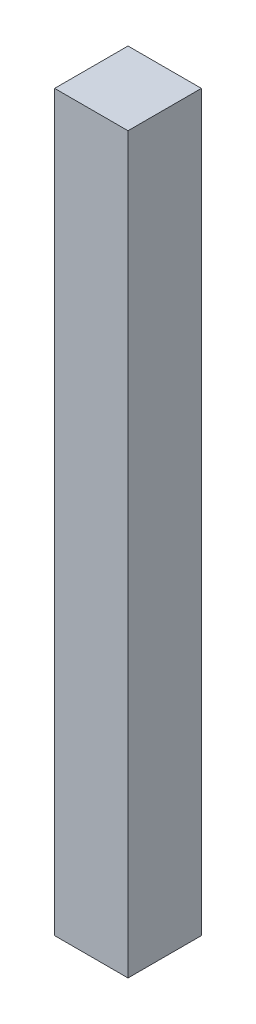
ISO-10303-21;
HEADER;
FILE_DESCRIPTION(('STEP AP214'),'2;1');
FILE_NAME('part.step','',(''),(''),'','','');
FILE_SCHEMA(('AUTOMOTIVE_DESIGN { 1 0 10303 214 1 1 1 1 }'));
ENDSEC;
DATA;
#1=APPLICATION_CONTEXT('core data for automotive mechanical design processes');
#2=APPLICATION_PROTOCOL_DEFINITION('international standard','automotive_design',2000,#1);
#3=PRODUCT_CONTEXT('',#1,'mechanical');
#4=PRODUCT('Part','Part','',(#3));
#5=PRODUCT_RELATED_PRODUCT_CATEGORY('part','',(#4));
#6=PRODUCT_DEFINITION_FORMATION('','',#4);
#7=PRODUCT_DEFINITION_CONTEXT('part definition',#1,'design');
#8=PRODUCT_DEFINITION('design','',#6,#7);
#9=PRODUCT_DEFINITION_SHAPE('','',#8);
#10=(LENGTH_UNIT() NAMED_UNIT(*) SI_UNIT(.MILLI.,.METRE.));
#11=(NAMED_UNIT(*) PLANE_ANGLE_UNIT() SI_UNIT($,.RADIAN.));
#12=(NAMED_UNIT(*) SI_UNIT($,.STERADIAN.) SOLID_ANGLE_UNIT());
#13=UNCERTAINTY_MEASURE_WITH_UNIT(LENGTH_MEASURE(1.E-05),#10,'distance_accuracy_value','');
#14=(GEOMETRIC_REPRESENTATION_CONTEXT(3) GLOBAL_UNCERTAINTY_ASSIGNED_CONTEXT((#13)) GLOBAL_UNIT_ASSIGNED_CONTEXT((#10,
#11,#12)) REPRESENTATION_CONTEXT('',''));
#15=CARTESIAN_POINT('',(0.,0.,0.));
#16=DIRECTION('',(0.,0.,1.));
#17=DIRECTION('',(1.,0.,0.));
#18=AXIS2_PLACEMENT_3D('',#15,#16,#17);
#19=CARTESIAN_POINT('',(10.,200.,-10.));
#20=DIRECTION('',(-1.,0.,0.));
#21=DIRECTION('',(0.,0.,1.));
#22=AXIS2_PLACEMENT_3D('',#19,#20,#21);
#23=PLANE('',#22);
#24=DIRECTION('',(0.,0.,-1.));
#25=VECTOR('',#24,1.);
#26=CARTESIAN_POINT('',(10.,0.,-10.));
#27=LINE('',#26,#25);
#28=CARTESIAN_POINT('',(10.,0.,10.));
#29=VERTEX_POINT('',#28);
#30=CARTESIAN_POINT('',(10.,0.,-10.));
#31=VERTEX_POINT('',#30);
#32=EDGE_CURVE('E97',#29,#31,#27,.T.);
#33=ORIENTED_EDGE('',*,*,#32,.T.);
#34=DIRECTION('',(0.,-1.,0.));
#35=VECTOR('',#34,1.);
#36=CARTESIAN_POINT('',(10.,200.,-10.));
#37=LINE('',#36,#35);
#38=CARTESIAN_POINT('',(10.,200.,-10.));
#39=VERTEX_POINT('',#38);
#40=EDGE_CURVE('E11',#39,#31,#37,.T.);
#41=ORIENTED_EDGE('',*,*,#40,.F.);
#42=DIRECTION('',(0.,0.,-1.));
#43=VECTOR('',#42,1.);
#44=CARTESIAN_POINT('',(10.,200.,-10.));
#45=LINE('',#44,#43);
#46=CARTESIAN_POINT('',(10.,200.,10.));
#47=VERTEX_POINT('',#46);
#48=EDGE_CURVE('E85',#47,#39,#45,.T.);
#49=ORIENTED_EDGE('',*,*,#48,.F.);
#50=DIRECTION('',(0.,-1.,0.));
#51=VECTOR('',#50,1.);
#52=CARTESIAN_POINT('',(10.,200.,10.));
#53=LINE('',#52,#51);
#54=EDGE_CURVE('E93',#47,#29,#53,.T.);
#55=ORIENTED_EDGE('',*,*,#54,.T.);
#56=EDGE_LOOP('',(#33,#41,#49,#55));
#57=FACE_BOUND('',#56,.T.);
#58=ADVANCED_FACE('F34',(#57),#23,.F.);
#59=CARTESIAN_POINT('',(-10.,200.,-10.));
#60=DIRECTION('',(0.,0.,1.));
#61=DIRECTION('',(1.,0.,0.));
#62=AXIS2_PLACEMENT_3D('',#59,#60,#61);
#63=PLANE('',#62);
#64=DIRECTION('',(-1.,0.,0.));
#65=VECTOR('',#64,1.);
#66=CARTESIAN_POINT('',(-10.,0.,-10.));
#67=LINE('',#66,#65);
#68=CARTESIAN_POINT('',(-10.,0.,-10.));
#69=VERTEX_POINT('',#68);
#70=EDGE_CURVE('E89',#31,#69,#67,.T.);
#71=ORIENTED_EDGE('',*,*,#70,.T.);
#72=DIRECTION('',(0.,-1.,0.));
#73=VECTOR('',#72,1.);
#74=CARTESIAN_POINT('',(-10.,200.,-10.));
#75=LINE('',#74,#73);
#76=CARTESIAN_POINT('',(-10.,200.,-10.));
#77=VERTEX_POINT('',#76);
#78=EDGE_CURVE('E42',#77,#69,#75,.T.);
#79=ORIENTED_EDGE('',*,*,#78,.F.);
#80=DIRECTION('',(-1.,0.,0.));
#81=VECTOR('',#80,1.);
#82=CARTESIAN_POINT('',(-10.,200.,-10.));
#83=LINE('',#82,#81);
#84=EDGE_CURVE('E80',#39,#77,#83,.T.);
#85=ORIENTED_EDGE('',*,*,#84,.F.);
#86=ORIENTED_EDGE('',*,*,#40,.T.);
#87=EDGE_LOOP('',(#71,#79,#85,#86));
#88=FACE_BOUND('',#87,.T.);
#89=ADVANCED_FACE('F88',(#88),#63,.F.);
#90=CARTESIAN_POINT('',(-10.,200.,-10.));
#91=DIRECTION('',(1.,0.,0.));
#92=DIRECTION('',(0.,0.,-1.));
#93=AXIS2_PLACEMENT_3D('',#90,#91,#92);
#94=PLANE('',#93);
#95=DIRECTION('',(0.,0.,1.));
#96=VECTOR('',#95,1.);
#97=CARTESIAN_POINT('',(-10.,0.,-10.));
#98=LINE('',#97,#96);
#99=CARTESIAN_POINT('',(-10.,0.,10.));
#100=VERTEX_POINT('',#99);
#101=EDGE_CURVE('E67',#69,#100,#98,.T.);
#102=ORIENTED_EDGE('',*,*,#101,.T.);
#103=DIRECTION('',(0.,-1.,0.));
#104=VECTOR('',#103,1.);
#105=CARTESIAN_POINT('',(-10.,200.,10.));
#106=LINE('',#105,#104);
#107=CARTESIAN_POINT('',(-10.,200.,10.));
#108=VERTEX_POINT('',#107);
#109=EDGE_CURVE('E90',#108,#100,#106,.T.);
#110=ORIENTED_EDGE('',*,*,#109,.F.);
#111=DIRECTION('',(0.,0.,1.));
#112=VECTOR('',#111,1.);
#113=CARTESIAN_POINT('',(-10.,200.,-10.));
#114=LINE('',#113,#112);
#115=EDGE_CURVE('E83',#77,#108,#114,.T.);
#116=ORIENTED_EDGE('',*,*,#115,.F.);
#117=ORIENTED_EDGE('',*,*,#78,.T.);
#118=EDGE_LOOP('',(#102,#110,#116,#117));
#119=FACE_BOUND('',#118,.T.);
#120=ADVANCED_FACE('F91',(#119),#94,.F.);
#121=CARTESIAN_POINT('',(-10.,200.,10.));
#122=DIRECTION('',(0.,0.,-1.));
#123=DIRECTION('',(-1.,0.,0.));
#124=AXIS2_PLACEMENT_3D('',#121,#122,#123);
#125=PLANE('',#124);
#126=DIRECTION('',(1.,0.,0.));
#127=VECTOR('',#126,1.);
#128=CARTESIAN_POINT('',(-10.,0.,10.));
#129=LINE('',#128,#127);
#130=EDGE_CURVE('E73',#100,#29,#129,.T.);
#131=ORIENTED_EDGE('',*,*,#130,.T.);
#132=ORIENTED_EDGE('',*,*,#54,.F.);
#133=DIRECTION('',(1.,0.,0.));
#134=VECTOR('',#133,1.);
#135=CARTESIAN_POINT('',(-10.,200.,10.));
#136=LINE('',#135,#134);
#137=EDGE_CURVE('E50',#108,#47,#136,.T.);
#138=ORIENTED_EDGE('',*,*,#137,.F.);
#139=ORIENTED_EDGE('',*,*,#109,.T.);
#140=EDGE_LOOP('',(#131,#132,#138,#139));
#141=FACE_BOUND('',#140,.T.);
#142=ADVANCED_FACE('F104',(#141),#125,.F.);
#143=CARTESIAN_POINT('',(0.,200.,0.));
#144=DIRECTION('',(0.,1.,0.));
#145=DIRECTION('',(0.,0.,1.));
#146=AXIS2_PLACEMENT_3D('',#143,#144,#145);
#147=PLANE('',#146);
#148=ORIENTED_EDGE('',*,*,#48,.T.);
#149=ORIENTED_EDGE('',*,*,#84,.T.);
#150=ORIENTED_EDGE('',*,*,#115,.T.);
#151=ORIENTED_EDGE('',*,*,#137,.T.);
#152=EDGE_LOOP('',(#148,#149,#150,#151));
#153=FACE_BOUND('',#152,.T.);
#154=ADVANCED_FACE('F81',(#153),#147,.T.);
#155=CARTESIAN_POINT('',(0.,0.,0.));
#156=DIRECTION('',(0.,1.,0.));
#157=DIRECTION('',(0.,0.,1.));
#158=AXIS2_PLACEMENT_3D('',#155,#156,#157);
#159=PLANE('',#158);
#160=ORIENTED_EDGE('',*,*,#32,.F.);
#161=ORIENTED_EDGE('',*,*,#130,.F.);
#162=ORIENTED_EDGE('',*,*,#101,.F.);
#163=ORIENTED_EDGE('',*,*,#70,.F.);
#164=EDGE_LOOP('',(#160,#161,#162,#163));
#165=FACE_BOUND('',#164,.T.);
#166=ADVANCED_FACE('F107',(#165),#159,.F.);
#167=CLOSED_SHELL('',(#58,#89,#120,#142,#154,#166));
#168=MANIFOLD_SOLID_BREP('B2',#167);
#169=ADVANCED_BREP_SHAPE_REPRESENTATION('',(#18,#168),#14);
#170=SHAPE_DEFINITION_REPRESENTATION(#9,#169);
ENDSEC;
END-ISO-10303-21;
